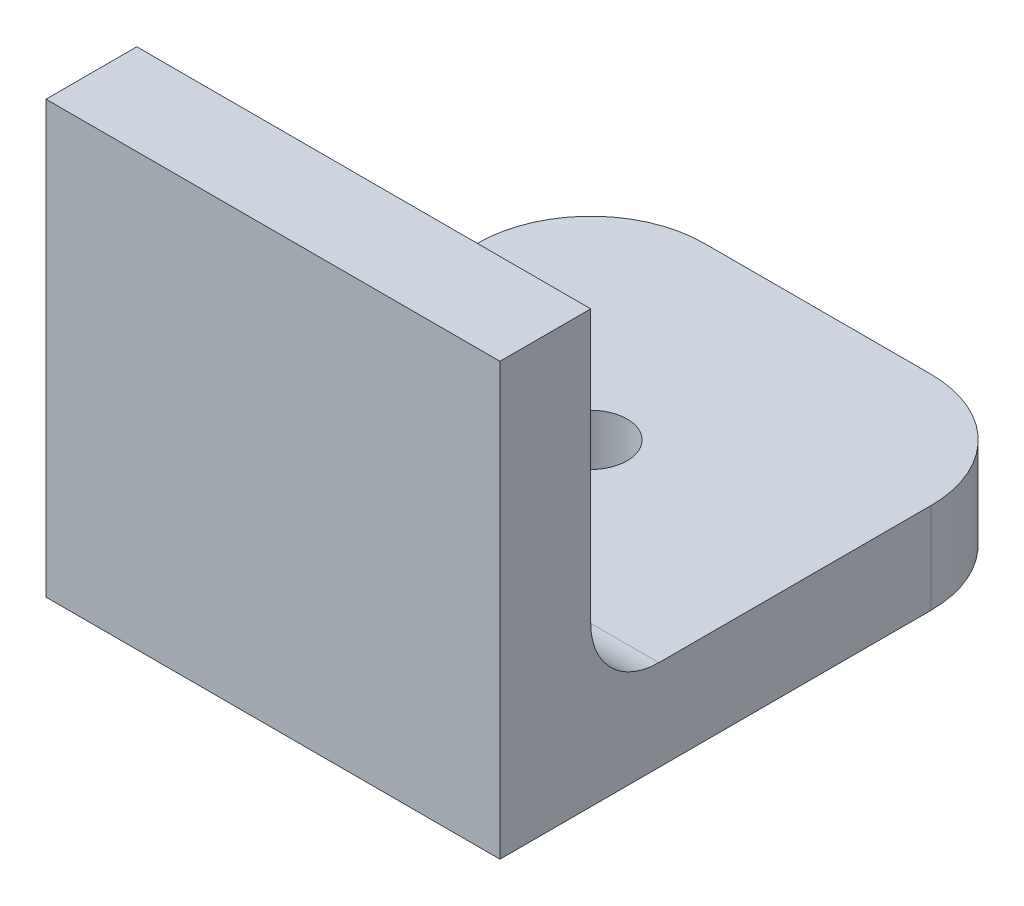
ISO-10303-21;
HEADER;
FILE_DESCRIPTION(('STEP AP214'),'2;1');
FILE_NAME('part.step','',(''),(''),'','','');
FILE_SCHEMA(('AUTOMOTIVE_DESIGN { 1 0 10303 214 1 1 1 1 }'));
ENDSEC;
DATA;
#1=APPLICATION_CONTEXT('core data for automotive mechanical design processes');
#2=APPLICATION_PROTOCOL_DEFINITION('international standard','automotive_design',2000,#1);
#3=PRODUCT_CONTEXT('',#1,'mechanical');
#4=PRODUCT('Part','Part','',(#3));
#5=PRODUCT_RELATED_PRODUCT_CATEGORY('part','',(#4));
#6=PRODUCT_DEFINITION_FORMATION('','',#4);
#7=PRODUCT_DEFINITION_CONTEXT('part definition',#1,'design');
#8=PRODUCT_DEFINITION('design','',#6,#7);
#9=PRODUCT_DEFINITION_SHAPE('','',#8);
#10=(LENGTH_UNIT() NAMED_UNIT(*) SI_UNIT(.MILLI.,.METRE.));
#11=(NAMED_UNIT(*) PLANE_ANGLE_UNIT() SI_UNIT($,.RADIAN.));
#12=(NAMED_UNIT(*) SI_UNIT($,.STERADIAN.) SOLID_ANGLE_UNIT());
#13=UNCERTAINTY_MEASURE_WITH_UNIT(LENGTH_MEASURE(1.E-05),#10,'distance_accuracy_value','');
#14=(GEOMETRIC_REPRESENTATION_CONTEXT(3) GLOBAL_UNCERTAINTY_ASSIGNED_CONTEXT((#13)) GLOBAL_UNIT_ASSIGNED_CONTEXT((#10,
#11,#12)) REPRESENTATION_CONTEXT('',''));
#15=CARTESIAN_POINT('',(0.,0.,0.));
#16=DIRECTION('',(0.,0.,1.));
#17=DIRECTION('',(1.,0.,0.));
#18=AXIS2_PLACEMENT_3D('',#15,#16,#17);
#19=CARTESIAN_POINT('',(0.,4.,0.));
#20=DIRECTION('',(0.,1.,0.));
#21=DIRECTION('',(0.,0.,1.));
#22=AXIS2_PLACEMENT_3D('',#19,#20,#21);
#23=PLANE('',#22);
#24=DIRECTION('',(-1.,0.,0.));
#25=VECTOR('',#24,1.);
#26=CARTESIAN_POINT('',(0.,4.,0.));
#27=LINE('',#26,#25);
#28=CARTESIAN_POINT('',(15.,4.,0.));
#29=VERTEX_POINT('',#28);
#30=CARTESIAN_POINT('',(5.,4.,0.));
#31=VERTEX_POINT('',#30);
#32=EDGE_CURVE('E158',#29,#31,#27,.T.);
#33=ORIENTED_EDGE('',*,*,#32,.T.);
#34=CARTESIAN_POINT('',(5.,4.,5.));
#35=DIRECTION('',(0.,1.,0.));
#36=DIRECTION('',(0.,0.,1.));
#37=AXIS2_PLACEMENT_3D('',#34,#35,#36);
#38=CIRCLE('',#37,5.);
#39=CARTESIAN_POINT('',(0.,4.,5.));
#40=VERTEX_POINT('',#39);
#41=EDGE_CURVE('E41',#31,#40,#38,.T.);
#42=ORIENTED_EDGE('',*,*,#41,.T.);
#43=DIRECTION('',(0.,0.,1.));
#44=VECTOR('',#43,1.);
#45=CARTESIAN_POINT('',(0.,4.,0.));
#46=LINE('',#45,#44);
#47=CARTESIAN_POINT('',(0.,4.,17.));
#48=VERTEX_POINT('',#47);
#49=EDGE_CURVE('E153',#40,#48,#46,.T.);
#50=ORIENTED_EDGE('',*,*,#49,.T.);
#51=DIRECTION('',(1.,0.,0.));
#52=VECTOR('',#51,1.);
#53=CARTESIAN_POINT('',(20.,4.,17.));
#54=LINE('',#53,#52);
#55=CARTESIAN_POINT('',(20.,4.,17.));
#56=VERTEX_POINT('',#55);
#57=EDGE_CURVE('E160',#48,#56,#54,.T.);
#58=ORIENTED_EDGE('',*,*,#57,.T.);
#59=DIRECTION('',(0.,0.,-1.));
#60=VECTOR('',#59,1.);
#61=CARTESIAN_POINT('',(20.,4.,0.));
#62=LINE('',#61,#60);
#63=CARTESIAN_POINT('',(20.,4.,5.));
#64=VERTEX_POINT('',#63);
#65=EDGE_CURVE('E155',#56,#64,#62,.T.);
#66=ORIENTED_EDGE('',*,*,#65,.T.);
#67=CARTESIAN_POINT('',(15.,4.,5.));
#68=DIRECTION('',(0.,1.,0.));
#69=DIRECTION('',(0.,0.,1.));
#70=AXIS2_PLACEMENT_3D('',#67,#68,#69);
#71=CIRCLE('',#70,5.);
#72=EDGE_CURVE('E183',#64,#29,#71,.T.);
#73=ORIENTED_EDGE('',*,*,#72,.T.);
#74=EDGE_LOOP('',(#33,#42,#50,#58,#66,#73));
#75=FACE_BOUND('',#74,.T.);
#76=CARTESIAN_POINT('',(10.,4.,10.));
#77=DIRECTION('',(0.,1.,0.));
#78=DIRECTION('',(0.,0.,1.));
#79=AXIS2_PLACEMENT_3D('',#76,#77,#78);
#80=CIRCLE('',#79,1.6);
#81=CARTESIAN_POINT('',(10.,4.,11.6));
#82=VERTEX_POINT('',#81);
#83=EDGE_CURVE('E147',#82,#82,#80,.T.);
#84=ORIENTED_EDGE('',*,*,#83,.F.);
#85=EDGE_LOOP('',(#84));
#86=FACE_BOUND('',#85,.T.);
#87=ADVANCED_FACE('F33',(#75,#86),#23,.T.);
#88=CARTESIAN_POINT('',(0.,0.,0.));
#89=DIRECTION('',(0.,1.,0.));
#90=DIRECTION('',(0.,0.,1.));
#91=AXIS2_PLACEMENT_3D('',#88,#89,#90);
#92=PLANE('',#91);
#93=DIRECTION('',(0.,0.,1.));
#94=VECTOR('',#93,1.);
#95=CARTESIAN_POINT('',(0.,0.,0.));
#96=LINE('',#95,#94);
#97=CARTESIAN_POINT('',(0.,0.,5.));
#98=VERTEX_POINT('',#97);
#99=CARTESIAN_POINT('',(0.,0.,24.));
#100=VERTEX_POINT('',#99);
#101=EDGE_CURVE('E150',#98,#100,#96,.T.);
#102=ORIENTED_EDGE('',*,*,#101,.F.);
#103=CARTESIAN_POINT('',(5.,0.,5.));
#104=DIRECTION('',(0.,1.,0.));
#105=DIRECTION('',(0.,0.,1.));
#106=AXIS2_PLACEMENT_3D('',#103,#104,#105);
#107=CIRCLE('',#106,5.);
#108=CARTESIAN_POINT('',(5.,0.,0.));
#109=VERTEX_POINT('',#108);
#110=EDGE_CURVE('E177',#98,#109,#107,.F.);
#111=ORIENTED_EDGE('',*,*,#110,.T.);
#112=DIRECTION('',(-1.,0.,0.));
#113=VECTOR('',#112,1.);
#114=CARTESIAN_POINT('',(0.,0.,0.));
#115=LINE('',#114,#113);
#116=CARTESIAN_POINT('',(15.,0.,0.));
#117=VERTEX_POINT('',#116);
#118=EDGE_CURVE('E156',#117,#109,#115,.T.);
#119=ORIENTED_EDGE('',*,*,#118,.F.);
#120=CARTESIAN_POINT('',(15.,0.,5.));
#121=DIRECTION('',(0.,1.,0.));
#122=DIRECTION('',(0.,0.,1.));
#123=AXIS2_PLACEMENT_3D('',#120,#121,#122);
#124=CIRCLE('',#123,5.);
#125=CARTESIAN_POINT('',(20.,0.,5.));
#126=VERTEX_POINT('',#125);
#127=EDGE_CURVE('E175',#117,#126,#124,.F.);
#128=ORIENTED_EDGE('',*,*,#127,.T.);
#129=DIRECTION('',(0.,0.,-1.));
#130=VECTOR('',#129,1.);
#131=CARTESIAN_POINT('',(20.,0.,0.));
#132=LINE('',#131,#130);
#133=CARTESIAN_POINT('',(20.,0.,24.));
#134=VERTEX_POINT('',#133);
#135=EDGE_CURVE('E162',#134,#126,#132,.T.);
#136=ORIENTED_EDGE('',*,*,#135,.F.);
#137=DIRECTION('',(-1.,0.,0.));
#138=VECTOR('',#137,1.);
#139=CARTESIAN_POINT('',(0.,0.,24.));
#140=LINE('',#139,#138);
#141=EDGE_CURVE('E134',#134,#100,#140,.T.);
#142=ORIENTED_EDGE('',*,*,#141,.T.);
#143=EDGE_LOOP('',(#102,#111,#119,#128,#136,#142));
#144=FACE_BOUND('',#143,.T.);
#145=CARTESIAN_POINT('',(10.,0.,10.));
#146=DIRECTION('',(0.,1.,0.));
#147=DIRECTION('',(0.,0.,1.));
#148=AXIS2_PLACEMENT_3D('',#145,#146,#147);
#149=CIRCLE('',#148,1.6);
#150=CARTESIAN_POINT('',(10.,0.,11.6));
#151=VERTEX_POINT('',#150);
#152=EDGE_CURVE('E142',#151,#151,#149,.T.);
#153=ORIENTED_EDGE('',*,*,#152,.T.);
#154=EDGE_LOOP('',(#153));
#155=FACE_BOUND('',#154,.T.);
#156=ADVANCED_FACE('F194',(#144,#155),#92,.F.);
#157=CARTESIAN_POINT('',(0.,4.,0.));
#158=DIRECTION('',(1.,0.,0.));
#159=DIRECTION('',(0.,0.,-1.));
#160=AXIS2_PLACEMENT_3D('',#157,#158,#159);
#161=PLANE('',#160);
#162=ORIENTED_EDGE('',*,*,#49,.F.);
#163=DIRECTION('',(0.,-1.,0.));
#164=VECTOR('',#163,1.);
#165=CARTESIAN_POINT('',(0.,4.,5.));
#166=LINE('',#165,#164);
#167=EDGE_CURVE('E172',#40,#98,#166,.T.);
#168=ORIENTED_EDGE('',*,*,#167,.T.);
#169=ORIENTED_EDGE('',*,*,#101,.T.);
#170=DIRECTION('',(0.,-1.,0.));
#171=VECTOR('',#170,1.);
#172=CARTESIAN_POINT('',(0.,19.,24.));
#173=LINE('',#172,#171);
#174=CARTESIAN_POINT('',(0.,19.,24.));
#175=VERTEX_POINT('',#174);
#176=EDGE_CURVE('E133',#175,#100,#173,.T.);
#177=ORIENTED_EDGE('',*,*,#176,.F.);
#178=DIRECTION('',(0.,0.,-1.));
#179=VECTOR('',#178,1.);
#180=CARTESIAN_POINT('',(0.,19.,20.));
#181=LINE('',#180,#179);
#182=CARTESIAN_POINT('',(0.,19.,20.));
#183=VERTEX_POINT('',#182);
#184=EDGE_CURVE('E125',#175,#183,#181,.T.);
#185=ORIENTED_EDGE('',*,*,#184,.T.);
#186=DIRECTION('',(0.,-1.,0.));
#187=VECTOR('',#186,1.);
#188=CARTESIAN_POINT('',(0.,19.,20.));
#189=LINE('',#188,#187);
#190=CARTESIAN_POINT('',(0.,7.,20.));
#191=VERTEX_POINT('',#190);
#192=EDGE_CURVE('E106',#183,#191,#189,.T.);
#193=ORIENTED_EDGE('',*,*,#192,.T.);
#194=CARTESIAN_POINT('',(0.,7.,17.));
#195=DIRECTION('',(1.,0.,0.));
#196=DIRECTION('',(0.,0.,-1.));
#197=AXIS2_PLACEMENT_3D('',#194,#195,#196);
#198=CIRCLE('',#197,3.);
#199=EDGE_CURVE('E170',#191,#48,#198,.T.);
#200=ORIENTED_EDGE('',*,*,#199,.T.);
#201=EDGE_LOOP('',(#162,#168,#169,#177,#185,#193,#200));
#202=FACE_BOUND('',#201,.T.);
#203=ADVANCED_FACE('F131',(#202),#161,.F.);
#204=CARTESIAN_POINT('',(20.,4.,0.));
#205=DIRECTION('',(-1.,0.,0.));
#206=DIRECTION('',(0.,0.,1.));
#207=AXIS2_PLACEMENT_3D('',#204,#205,#206);
#208=PLANE('',#207);
#209=ORIENTED_EDGE('',*,*,#135,.T.);
#210=DIRECTION('',(0.,-1.,0.));
#211=VECTOR('',#210,1.);
#212=CARTESIAN_POINT('',(20.,4.,5.));
#213=LINE('',#212,#211);
#214=EDGE_CURVE('E11',#126,#64,#213,.F.);
#215=ORIENTED_EDGE('',*,*,#214,.T.);
#216=ORIENTED_EDGE('',*,*,#65,.F.);
#217=CARTESIAN_POINT('',(20.,7.,17.));
#218=DIRECTION('',(-1.,0.,0.));
#219=DIRECTION('',(0.,0.,1.));
#220=AXIS2_PLACEMENT_3D('',#217,#218,#219);
#221=CIRCLE('',#220,3.);
#222=CARTESIAN_POINT('',(20.,7.,20.));
#223=VERTEX_POINT('',#222);
#224=EDGE_CURVE('E168',#56,#223,#221,.T.);
#225=ORIENTED_EDGE('',*,*,#224,.T.);
#226=DIRECTION('',(0.,-1.,0.));
#227=VECTOR('',#226,1.);
#228=CARTESIAN_POINT('',(20.,19.,20.));
#229=LINE('',#228,#227);
#230=CARTESIAN_POINT('',(20.,19.,20.));
#231=VERTEX_POINT('',#230);
#232=EDGE_CURVE('E117',#231,#223,#229,.T.);
#233=ORIENTED_EDGE('',*,*,#232,.F.);
#234=DIRECTION('',(0.,0.,1.));
#235=VECTOR('',#234,1.);
#236=CARTESIAN_POINT('',(20.,19.,20.));
#237=LINE('',#236,#235);
#238=CARTESIAN_POINT('',(20.,19.,24.));
#239=VERTEX_POINT('',#238);
#240=EDGE_CURVE('E128',#231,#239,#237,.T.);
#241=ORIENTED_EDGE('',*,*,#240,.T.);
#242=DIRECTION('',(0.,-1.,0.));
#243=VECTOR('',#242,1.);
#244=CARTESIAN_POINT('',(20.,19.,24.));
#245=LINE('',#244,#243);
#246=EDGE_CURVE('E143',#239,#134,#245,.T.);
#247=ORIENTED_EDGE('',*,*,#246,.T.);
#248=EDGE_LOOP('',(#209,#215,#216,#225,#233,#241,#247));
#249=FACE_BOUND('',#248,.T.);
#250=ADVANCED_FACE('F200',(#249),#208,.F.);
#251=CARTESIAN_POINT('',(0.,4.,0.));
#252=DIRECTION('',(0.,0.,1.));
#253=DIRECTION('',(1.,0.,0.));
#254=AXIS2_PLACEMENT_3D('',#251,#252,#253);
#255=PLANE('',#254);
#256=ORIENTED_EDGE('',*,*,#118,.T.);
#257=DIRECTION('',(0.,-1.,0.));
#258=VECTOR('',#257,1.);
#259=CARTESIAN_POINT('',(5.,4.,0.));
#260=LINE('',#259,#258);
#261=EDGE_CURVE('E54',#109,#31,#260,.F.);
#262=ORIENTED_EDGE('',*,*,#261,.T.);
#263=ORIENTED_EDGE('',*,*,#32,.F.);
#264=DIRECTION('',(0.,-1.,0.));
#265=VECTOR('',#264,1.);
#266=CARTESIAN_POINT('',(15.,4.,0.));
#267=LINE('',#266,#265);
#268=EDGE_CURVE('E179',#29,#117,#267,.T.);
#269=ORIENTED_EDGE('',*,*,#268,.T.);
#270=EDGE_LOOP('',(#256,#262,#263,#269));
#271=FACE_BOUND('',#270,.T.);
#272=ADVANCED_FACE('F196',(#271),#255,.F.);
#273=CARTESIAN_POINT('',(10.,4.,10.));
#274=DIRECTION('',(0.,-1.,0.));
#275=DIRECTION('',(0.,0.,-1.));
#276=AXIS2_PLACEMENT_3D('',#273,#274,#275);
#277=CYLINDRICAL_SURFACE('',#276,1.6);
#278=ORIENTED_EDGE('',*,*,#83,.T.);
#279=EDGE_LOOP('',(#278));
#280=FACE_BOUND('',#279,.T.);
#281=ORIENTED_EDGE('',*,*,#152,.F.);
#282=EDGE_LOOP('',(#281));
#283=FACE_BOUND('',#282,.T.);
#284=ADVANCED_FACE('F212',(#280,#283),#277,.F.);
#285=CARTESIAN_POINT('',(0.,19.,20.));
#286=DIRECTION('',(0.,0.,-1.));
#287=DIRECTION('',(-1.,0.,0.));
#288=AXIS2_PLACEMENT_3D('',#285,#286,#287);
#289=PLANE('',#288);
#290=ORIENTED_EDGE('',*,*,#232,.T.);
#291=DIRECTION('',(1.,0.,0.));
#292=VECTOR('',#291,1.);
#293=CARTESIAN_POINT('',(0.,7.,20.));
#294=LINE('',#293,#292);
#295=EDGE_CURVE('E112',#223,#191,#294,.F.);
#296=ORIENTED_EDGE('',*,*,#295,.T.);
#297=ORIENTED_EDGE('',*,*,#192,.F.);
#298=DIRECTION('',(1.,0.,0.));
#299=VECTOR('',#298,1.);
#300=CARTESIAN_POINT('',(0.,19.,20.));
#301=LINE('',#300,#299);
#302=EDGE_CURVE('E110',#183,#231,#301,.T.);
#303=ORIENTED_EDGE('',*,*,#302,.T.);
#304=EDGE_LOOP('',(#290,#296,#297,#303));
#305=FACE_BOUND('',#304,.T.);
#306=ADVANCED_FACE('F109',(#305),#289,.T.);
#307=CARTESIAN_POINT('',(0.,19.,24.));
#308=DIRECTION('',(0.,0.,1.));
#309=DIRECTION('',(1.,0.,0.));
#310=AXIS2_PLACEMENT_3D('',#307,#308,#309);
#311=PLANE('',#310);
#312=ORIENTED_EDGE('',*,*,#141,.F.);
#313=ORIENTED_EDGE('',*,*,#246,.F.);
#314=DIRECTION('',(-1.,0.,0.));
#315=VECTOR('',#314,1.);
#316=CARTESIAN_POINT('',(0.,19.,24.));
#317=LINE('',#316,#315);
#318=EDGE_CURVE('E118',#239,#175,#317,.T.);
#319=ORIENTED_EDGE('',*,*,#318,.T.);
#320=ORIENTED_EDGE('',*,*,#176,.T.);
#321=EDGE_LOOP('',(#312,#313,#319,#320));
#322=FACE_BOUND('',#321,.T.);
#323=ADVANCED_FACE('F203',(#322),#311,.T.);
#324=CARTESIAN_POINT('',(0.,19.,0.));
#325=DIRECTION('',(0.,1.,0.));
#326=DIRECTION('',(0.,0.,1.));
#327=AXIS2_PLACEMENT_3D('',#324,#325,#326);
#328=PLANE('',#327);
#329=ORIENTED_EDGE('',*,*,#184,.F.);
#330=ORIENTED_EDGE('',*,*,#318,.F.);
#331=ORIENTED_EDGE('',*,*,#240,.F.);
#332=ORIENTED_EDGE('',*,*,#302,.F.);
#333=EDGE_LOOP('',(#329,#330,#331,#332));
#334=FACE_BOUND('',#333,.T.);
#335=ADVANCED_FACE('F123',(#334),#328,.T.);
#336=CARTESIAN_POINT('',(0.,7.,17.));
#337=DIRECTION('',(-1.,0.,0.));
#338=DIRECTION('',(0.,0.,1.));
#339=AXIS2_PLACEMENT_3D('',#336,#337,#338);
#340=CYLINDRICAL_SURFACE('',#339,3.);
#341=ORIENTED_EDGE('',*,*,#199,.F.);
#342=ORIENTED_EDGE('',*,*,#295,.F.);
#343=ORIENTED_EDGE('',*,*,#224,.F.);
#344=ORIENTED_EDGE('',*,*,#57,.F.);
#345=EDGE_LOOP('',(#341,#342,#343,#344));
#346=FACE_BOUND('',#345,.T.);
#347=ADVANCED_FACE('F210',(#346),#340,.F.);
#348=CARTESIAN_POINT('',(5.,4.,5.));
#349=DIRECTION('',(0.,-1.,0.));
#350=DIRECTION('',(0.,0.,-1.));
#351=AXIS2_PLACEMENT_3D('',#348,#349,#350);
#352=CYLINDRICAL_SURFACE('',#351,5.);
#353=ORIENTED_EDGE('',*,*,#41,.F.);
#354=ORIENTED_EDGE('',*,*,#261,.F.);
#355=ORIENTED_EDGE('',*,*,#110,.F.);
#356=ORIENTED_EDGE('',*,*,#167,.F.);
#357=EDGE_LOOP('',(#353,#354,#355,#356));
#358=FACE_BOUND('',#357,.T.);
#359=ADVANCED_FACE('F191',(#358),#352,.T.);
#360=CARTESIAN_POINT('',(15.,4.,5.));
#361=DIRECTION('',(0.,-1.,0.));
#362=DIRECTION('',(0.,0.,-1.));
#363=AXIS2_PLACEMENT_3D('',#360,#361,#362);
#364=CYLINDRICAL_SURFACE('',#363,5.);
#365=ORIENTED_EDGE('',*,*,#72,.F.);
#366=ORIENTED_EDGE('',*,*,#214,.F.);
#367=ORIENTED_EDGE('',*,*,#127,.F.);
#368=ORIENTED_EDGE('',*,*,#268,.F.);
#369=EDGE_LOOP('',(#365,#366,#367,#368));
#370=FACE_BOUND('',#369,.T.);
#371=ADVANCED_FACE('F35',(#370),#364,.T.);
#372=CLOSED_SHELL('',(#87,#156,#203,#250,#272,#284,#306,#323,#335,#347,#359,#371));
#373=MANIFOLD_SOLID_BREP('B2',#372);
#374=ADVANCED_BREP_SHAPE_REPRESENTATION('',(#18,#373),#14);
#375=SHAPE_DEFINITION_REPRESENTATION(#9,#374);
ENDSEC;
END-ISO-10303-21;
